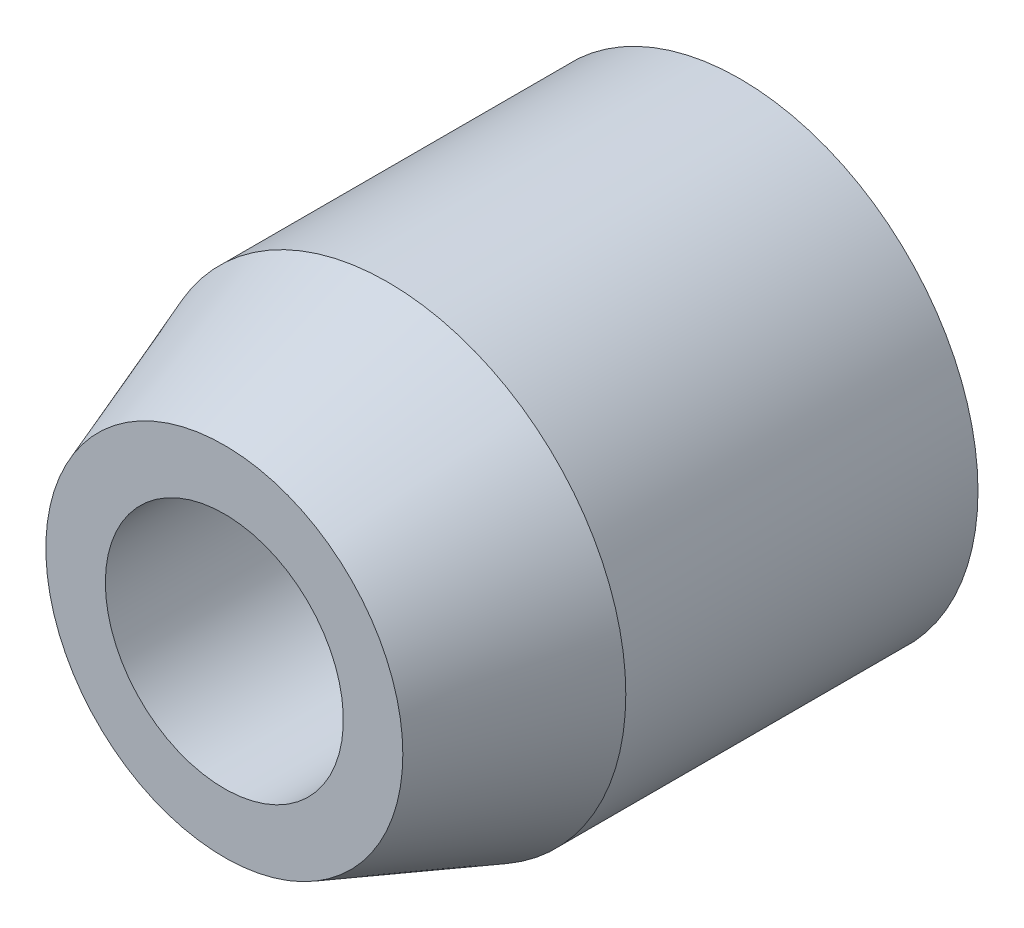
ISO-10303-21;
HEADER;
FILE_DESCRIPTION(('STEP AP214'),'2;1');
FILE_NAME('part.step','',(''),(''),'','','');
FILE_SCHEMA(('AUTOMOTIVE_DESIGN { 1 0 10303 214 1 1 1 1 }'));
ENDSEC;
DATA;
#1=APPLICATION_CONTEXT('core data for automotive mechanical design processes');
#2=APPLICATION_PROTOCOL_DEFINITION('international standard','automotive_design',2000,#1);
#3=PRODUCT_CONTEXT('',#1,'mechanical');
#4=PRODUCT('Part','Part','',(#3));
#5=PRODUCT_RELATED_PRODUCT_CATEGORY('part','',(#4));
#6=PRODUCT_DEFINITION_FORMATION('','',#4);
#7=PRODUCT_DEFINITION_CONTEXT('part definition',#1,'design');
#8=PRODUCT_DEFINITION('design','',#6,#7);
#9=PRODUCT_DEFINITION_SHAPE('','',#8);
#10=(LENGTH_UNIT() NAMED_UNIT(*) SI_UNIT(.MILLI.,.METRE.));
#11=(NAMED_UNIT(*) PLANE_ANGLE_UNIT() SI_UNIT($,.RADIAN.));
#12=(NAMED_UNIT(*) SI_UNIT($,.STERADIAN.) SOLID_ANGLE_UNIT());
#13=UNCERTAINTY_MEASURE_WITH_UNIT(LENGTH_MEASURE(1.E-05),#10,'distance_accuracy_value','');
#14=(GEOMETRIC_REPRESENTATION_CONTEXT(3) GLOBAL_UNCERTAINTY_ASSIGNED_CONTEXT((#13)) GLOBAL_UNIT_ASSIGNED_CONTEXT((#10,
#11,#12)) REPRESENTATION_CONTEXT('',''));
#15=CARTESIAN_POINT('',(0.,0.,0.));
#16=DIRECTION('',(0.,0.,1.));
#17=DIRECTION('',(1.,0.,0.));
#18=AXIS2_PLACEMENT_3D('',#15,#16,#17);
#19=CARTESIAN_POINT('',(0.,0.,13.));
#20=DIRECTION('',(0.,0.,1.));
#21=DIRECTION('',(1.,0.,0.));
#22=AXIS2_PLACEMENT_3D('',#19,#20,#21);
#23=PLANE('',#22);
#24=CARTESIAN_POINT('',(0.,0.,13.));
#25=DIRECTION('',(0.,0.,1.));
#26=DIRECTION('',(1.,0.,0.));
#27=AXIS2_PLACEMENT_3D('',#24,#25,#26);
#28=CIRCLE('',#27,3.);
#29=CARTESIAN_POINT('',(-3.,0.,13.));
#30=VERTEX_POINT('',#29);
#31=EDGE_CURVE('E51',#30,#30,#28,.T.);
#32=ORIENTED_EDGE('',*,*,#31,.F.);
#33=EDGE_LOOP('',(#32));
#34=FACE_BOUND('',#33,.T.);
#35=CARTESIAN_POINT('',(0.,0.,13.));
#36=DIRECTION('',(0.,0.,1.));
#37=DIRECTION('',(1.,0.,0.));
#38=AXIS2_PLACEMENT_3D('',#35,#36,#37);
#39=CIRCLE('',#38,4.5);
#40=CARTESIAN_POINT('',(4.5,0.,13.));
#41=VERTEX_POINT('',#40);
#42=EDGE_CURVE('E62',#41,#41,#39,.T.);
#43=ORIENTED_EDGE('',*,*,#42,.T.);
#44=EDGE_LOOP('',(#43));
#45=FACE_BOUND('',#44,.T.);
#46=ADVANCED_FACE('F42',(#34,#45),#23,.T.);
#47=CARTESIAN_POINT('',(0.,0.,13.));
#48=DIRECTION('',(0.,0.,-1.));
#49=DIRECTION('',(-1.,0.,0.));
#50=AXIS2_PLACEMENT_3D('',#47,#48,#49);
#51=CYLINDRICAL_SURFACE('',#50,6.);
#52=CARTESIAN_POINT('',(0.,0.,0.));
#53=DIRECTION('',(0.,0.,1.));
#54=DIRECTION('',(1.,0.,0.));
#55=AXIS2_PLACEMENT_3D('',#52,#53,#54);
#56=CIRCLE('',#55,6.);
#57=CARTESIAN_POINT('',(-6.,0.,0.));
#58=VERTEX_POINT('',#57);
#59=EDGE_CURVE('E11',#58,#58,#56,.T.);
#60=CARTESIAN_POINT('',(0.,0.,8.87878387081808));
#61=DIRECTION('',(0.,0.,-1.));
#62=DIRECTION('',(-1.,0.,0.));
#63=AXIS2_PLACEMENT_3D('',#60,#61,#62);
#64=CIRCLE('',#63,6.);
#65=CARTESIAN_POINT('',(-6.,0.,8.87878387081808));
#66=VERTEX_POINT('',#65);
#67=EDGE_CURVE('E46',#66,#66,#64,.F.);
#68=CARTESIAN_POINT('',(-6.,0.,0.));
#69=CARTESIAN_POINT('',(-6.,0.,0.0924873319876884));
#70=CARTESIAN_POINT('',(-6.,0.,0.184974663975377));
#71=CARTESIAN_POINT('',(-6.,0.,0.369949327950754));
#72=CARTESIAN_POINT('',(-6.,0.,0.462436659938442));
#73=CARTESIAN_POINT('',(-6.,0.,0.647411323913819));
#74=CARTESIAN_POINT('',(-6.,0.,0.739898655901507));
#75=CARTESIAN_POINT('',(-6.,0.,0.924873319876884));
#76=CARTESIAN_POINT('',(-6.,0.,1.01736065186457));
#77=CARTESIAN_POINT('',(-6.,0.,1.20233531583995));
#78=CARTESIAN_POINT('',(-6.,0.,1.29482264782764));
#79=CARTESIAN_POINT('',(-6.,0.,1.47979731180301));
#80=CARTESIAN_POINT('',(-6.,0.,1.5722846437907));
#81=CARTESIAN_POINT('',(-6.,0.,1.75725930776608));
#82=CARTESIAN_POINT('',(-6.,0.,1.84974663975377));
#83=CARTESIAN_POINT('',(-6.,0.,2.03472130372914));
#84=CARTESIAN_POINT('',(-6.,0.,2.12720863571683));
#85=CARTESIAN_POINT('',(-6.,0.,2.31218329969221));
#86=CARTESIAN_POINT('',(-6.,0.,2.4046706316799));
#87=CARTESIAN_POINT('',(-6.,0.,2.58964529565527));
#88=CARTESIAN_POINT('',(-6.,0.,2.68213262764296));
#89=CARTESIAN_POINT('',(-6.,0.,2.86710729161834));
#90=CARTESIAN_POINT('',(-6.,0.,2.95959462360603));
#91=CARTESIAN_POINT('',(-6.,0.,3.1445692875814));
#92=CARTESIAN_POINT('',(-6.,0.,3.23705661956909));
#93=CARTESIAN_POINT('',(-6.,0.,3.42203128354447));
#94=CARTESIAN_POINT('',(-6.,0.,3.51451861553216));
#95=CARTESIAN_POINT('',(-6.,0.,3.69949327950753));
#96=CARTESIAN_POINT('',(-6.,0.,3.79198061149522));
#97=CARTESIAN_POINT('',(-6.,0.,3.9769552754706));
#98=CARTESIAN_POINT('',(-6.,0.,4.06944260745829));
#99=CARTESIAN_POINT('',(-6.,0.,4.25441727143366));
#100=CARTESIAN_POINT('',(-6.,0.,4.34690460342135));
#101=CARTESIAN_POINT('',(-6.,0.,4.53187926739673));
#102=CARTESIAN_POINT('',(-6.,0.,4.62436659938442));
#103=CARTESIAN_POINT('',(-6.,0.,4.80934126335979));
#104=CARTESIAN_POINT('',(-6.,0.,4.90182859534748));
#105=CARTESIAN_POINT('',(-6.,0.,5.08680325932286));
#106=CARTESIAN_POINT('',(-6.,0.,5.17929059131055));
#107=CARTESIAN_POINT('',(-6.,0.,5.36426525528592));
#108=CARTESIAN_POINT('',(-6.,0.,5.45675258727361));
#109=CARTESIAN_POINT('',(-6.,0.,5.64172725124899));
#110=CARTESIAN_POINT('',(-6.,0.,5.73421458323668));
#111=CARTESIAN_POINT('',(-6.,0.,5.91918924721205));
#112=CARTESIAN_POINT('',(-6.,0.,6.01167657919974));
#113=CARTESIAN_POINT('',(-6.,0.,6.19665124317512));
#114=CARTESIAN_POINT('',(-6.,0.,6.28913857516281));
#115=CARTESIAN_POINT('',(-6.,0.,6.47411323913818));
#116=CARTESIAN_POINT('',(-6.,0.,6.56660057112587));
#117=CARTESIAN_POINT('',(-6.,0.,6.75157523510125));
#118=CARTESIAN_POINT('',(-6.,0.,6.84406256708894));
#119=CARTESIAN_POINT('',(-6.,0.,7.02903723106431));
#120=CARTESIAN_POINT('',(-6.,0.,7.121524563052));
#121=CARTESIAN_POINT('',(-6.,0.,7.30649922702738));
#122=CARTESIAN_POINT('',(-6.,0.,7.39898655901507));
#123=CARTESIAN_POINT('',(-6.,0.,7.58396122299044));
#124=CARTESIAN_POINT('',(-6.,0.,7.67644855497813));
#125=CARTESIAN_POINT('',(-6.,0.,7.86142321895351));
#126=CARTESIAN_POINT('',(-6.,0.,7.9539105509412));
#127=CARTESIAN_POINT('',(-6.,0.,8.13888521491657));
#128=CARTESIAN_POINT('',(-6.,0.,8.23137254690426));
#129=CARTESIAN_POINT('',(-6.,0.,8.41634721087964));
#130=CARTESIAN_POINT('',(-6.,0.,8.50883454286733));
#131=CARTESIAN_POINT('',(-6.,0.,8.6938092068427));
#132=CARTESIAN_POINT('',(-6.,0.,8.78629653883039));
#133=CARTESIAN_POINT('',(-6.,0.,8.87878387081808));
#134=B_SPLINE_CURVE_WITH_KNOTS('',3,(#68,#69,#70,#71,#72,#73,#74,#75,#76,#77,#78,#79,#80,#81,
#82,#83,#84,#85,#86,#87,#88,#89,#90,#91,#92,#93,#94,#95,#96,#97,#98,#99,#100,#101,#102,#103,
#104,#105,#106,#107,#108,#109,#110,#111,#112,#113,#114,#115,#116,#117,#118,#119,#120,#121,#122,
#123,#124,#125,#126,#127,#128,#129,#130,#131,#132,#133),.UNSPECIFIED.,.F.,.F.,(4,2,2,2,2,2,2,2,
2,2,2,2,2,2,2,2,2,2,2,2,2,2,2,2,2,2,2,2,2,2,2,2,4),(0.,0.277461995963065,0.55492399192613,
0.832385987889195,1.10984798385226,1.38730997981533,1.66477197577839,1.94223397174145,
2.21969596770452,2.49715796366758,2.77461995963065,3.05208195559372,3.32954395155678,
3.60700594751985,3.88446794348291,4.16192993944597,4.43939193540904,4.7168539313721,
4.99431592733517,5.27177792329823,5.5492399192613,5.82670191522436,6.10416391118743,
6.38162590715049,6.65908790311356,6.93654989907662,7.21401189503969,7.49147389100275,
7.76893588696582,8.04639788292888,8.32385987889195,8.60132187485501,8.87878387081808),.UNSPECIFIED.);
#135=EDGE_CURVE('BSEAM44',#58,#66,#134,.T.);
#136=ORIENTED_EDGE('',*,*,#59,.T.);
#137=ORIENTED_EDGE('',*,*,#67,.F.);
#138=ORIENTED_EDGE('',*,*,#135,.T.);
#139=ORIENTED_EDGE('',*,*,#135,.F.);
#140=EDGE_LOOP('',(#136,#138,#137,#139));
#141=FACE_BOUND('',#140,.T.);
#142=ADVANCED_FACE('F44',(#141),#51,.T.);
#143=CARTESIAN_POINT('',(0.,0.,0.));
#144=DIRECTION('',(0.,0.,1.));
#145=DIRECTION('',(1.,0.,0.));
#146=AXIS2_PLACEMENT_3D('',#143,#144,#145);
#147=PLANE('',#146);
#148=ORIENTED_EDGE('',*,*,#59,.F.);
#149=EDGE_LOOP('',(#148));
#150=FACE_BOUND('',#149,.T.);
#151=CARTESIAN_POINT('',(0.,0.,0.));
#152=DIRECTION('',(0.,0.,1.));
#153=DIRECTION('',(1.,0.,0.));
#154=AXIS2_PLACEMENT_3D('',#151,#152,#153);
#155=CIRCLE('',#154,3.);
#156=CARTESIAN_POINT('',(-3.,0.,0.));
#157=VERTEX_POINT('',#156);
#158=EDGE_CURVE('E56',#157,#157,#155,.T.);
#159=ORIENTED_EDGE('',*,*,#158,.T.);
#160=EDGE_LOOP('',(#159));
#161=FACE_BOUND('',#160,.T.);
#162=ADVANCED_FACE('F74',(#150,#161),#147,.F.);
#163=CARTESIAN_POINT('',(0.,0.,13.));
#164=DIRECTION('',(0.,0.,-1.));
#165=DIRECTION('',(-1.,0.,0.));
#166=AXIS2_PLACEMENT_3D('',#163,#164,#165);
#167=CYLINDRICAL_SURFACE('',#166,3.);
#168=CARTESIAN_POINT('',(-3.,0.,13.));
#169=CARTESIAN_POINT('',(-3.,0.,12.8645833333333));
#170=CARTESIAN_POINT('',(-3.,0.,12.7291666666667));
#171=CARTESIAN_POINT('',(-3.,0.,12.4583333333333));
#172=CARTESIAN_POINT('',(-3.,0.,12.3229166666667));
#173=CARTESIAN_POINT('',(-3.,0.,12.0520833333333));
#174=CARTESIAN_POINT('',(-3.,0.,11.9166666666667));
#175=CARTESIAN_POINT('',(-3.,0.,11.6458333333333));
#176=CARTESIAN_POINT('',(-3.,0.,11.5104166666667));
#177=CARTESIAN_POINT('',(-3.,0.,11.2395833333333));
#178=CARTESIAN_POINT('',(-3.,0.,11.1041666666667));
#179=CARTESIAN_POINT('',(-3.,0.,10.8333333333333));
#180=CARTESIAN_POINT('',(-3.,0.,10.6979166666667));
#181=CARTESIAN_POINT('',(-3.,0.,10.4270833333333));
#182=CARTESIAN_POINT('',(-3.,0.,10.2916666666667));
#183=CARTESIAN_POINT('',(-3.,0.,10.0208333333333));
#184=CARTESIAN_POINT('',(-3.,0.,9.88541666666667));
#185=CARTESIAN_POINT('',(-3.,0.,9.61458333333333));
#186=CARTESIAN_POINT('',(-3.,0.,9.47916666666667));
#187=CARTESIAN_POINT('',(-3.,0.,9.20833333333333));
#188=CARTESIAN_POINT('',(-3.,0.,9.07291666666667));
#189=CARTESIAN_POINT('',(-3.,0.,8.80208333333333));
#190=CARTESIAN_POINT('',(-3.,0.,8.66666666666667));
#191=CARTESIAN_POINT('',(-3.,0.,8.39583333333333));
#192=CARTESIAN_POINT('',(-3.,0.,8.26041666666667));
#193=CARTESIAN_POINT('',(-3.,0.,7.98958333333333));
#194=CARTESIAN_POINT('',(-3.,0.,7.85416666666667));
#195=CARTESIAN_POINT('',(-3.,0.,7.58333333333333));
#196=CARTESIAN_POINT('',(-3.,0.,7.44791666666667));
#197=CARTESIAN_POINT('',(-3.,0.,7.17708333333333));
#198=CARTESIAN_POINT('',(-3.,0.,7.04166666666667));
#199=CARTESIAN_POINT('',(-3.,0.,6.77083333333333));
#200=CARTESIAN_POINT('',(-3.,0.,6.63541666666667));
#201=CARTESIAN_POINT('',(-3.,0.,6.36458333333333));
#202=CARTESIAN_POINT('',(-3.,0.,6.22916666666667));
#203=CARTESIAN_POINT('',(-3.,0.,5.95833333333333));
#204=CARTESIAN_POINT('',(-3.,0.,5.82291666666667));
#205=CARTESIAN_POINT('',(-3.,0.,5.55208333333333));
#206=CARTESIAN_POINT('',(-3.,0.,5.41666666666667));
#207=CARTESIAN_POINT('',(-3.,0.,5.14583333333333));
#208=CARTESIAN_POINT('',(-3.,0.,5.01041666666667));
#209=CARTESIAN_POINT('',(-3.,0.,4.73958333333333));
#210=CARTESIAN_POINT('',(-3.,0.,4.60416666666667));
#211=CARTESIAN_POINT('',(-3.,0.,4.33333333333333));
#212=CARTESIAN_POINT('',(-3.,0.,4.19791666666667));
#213=CARTESIAN_POINT('',(-3.,0.,3.92708333333333));
#214=CARTESIAN_POINT('',(-3.,0.,3.79166666666667));
#215=CARTESIAN_POINT('',(-3.,0.,3.52083333333333));
#216=CARTESIAN_POINT('',(-3.,0.,3.38541666666667));
#217=CARTESIAN_POINT('',(-3.,0.,3.11458333333333));
#218=CARTESIAN_POINT('',(-3.,0.,2.97916666666667));
#219=CARTESIAN_POINT('',(-3.,0.,2.70833333333333));
#220=CARTESIAN_POINT('',(-3.,0.,2.57291666666667));
#221=CARTESIAN_POINT('',(-3.,0.,2.30208333333333));
#222=CARTESIAN_POINT('',(-3.,0.,2.16666666666667));
#223=CARTESIAN_POINT('',(-3.,0.,1.89583333333333));
#224=CARTESIAN_POINT('',(-3.,0.,1.76041666666667));
#225=CARTESIAN_POINT('',(-3.,0.,1.48958333333333));
#226=CARTESIAN_POINT('',(-3.,0.,1.35416666666667));
#227=CARTESIAN_POINT('',(-3.,0.,1.08333333333333));
#228=CARTESIAN_POINT('',(-3.,0.,0.947916666666667));
#229=CARTESIAN_POINT('',(-3.,0.,0.677083333333334));
#230=CARTESIAN_POINT('',(-3.,0.,0.541666666666667));
#231=CARTESIAN_POINT('',(-3.,0.,0.270833333333334));
#232=CARTESIAN_POINT('',(-3.,0.,0.135416666666667));
#233=CARTESIAN_POINT('',(-3.,0.,0.));
#234=B_SPLINE_CURVE_WITH_KNOTS('',3,(#168,#169,#170,#171,#172,#173,#174,#175,#176,#177,#178,
#179,#180,#181,#182,#183,#184,#185,#186,#187,#188,#189,#190,#191,#192,#193,#194,#195,#196,#197,
#198,#199,#200,#201,#202,#203,#204,#205,#206,#207,#208,#209,#210,#211,#212,#213,#214,#215,#216,
#217,#218,#219,#220,#221,#222,#223,#224,#225,#226,#227,#228,#229,#230,#231,#232,#233),
.UNSPECIFIED.,.F.,.F.,(4,2,2,2,2,2,2,2,2,2,2,2,2,2,2,2,2,2,2,2,2,2,2,2,2,2,2,2,2,2,2,2,4),(0.,
0.406249999999999,0.812499999999999,1.21875,1.625,2.03125,2.4375,2.84375,3.25,3.65625,4.0625,
4.46875,4.875,5.28125,5.6875,6.09375,6.5,6.90625,7.3125,7.71875,8.125,8.53125,8.9375,9.34375,
9.75,10.15625,10.5625,10.96875,11.375,11.78125,12.1875,12.59375,13.),.UNSPECIFIED.);
#235=EDGE_CURVE('BSEAM79',#30,#157,#234,.T.);
#236=ORIENTED_EDGE('',*,*,#31,.T.);
#237=ORIENTED_EDGE('',*,*,#158,.F.);
#238=ORIENTED_EDGE('',*,*,#235,.T.);
#239=ORIENTED_EDGE('',*,*,#235,.F.);
#240=EDGE_LOOP('',(#236,#238,#237,#239));
#241=FACE_BOUND('',#240,.T.);
#242=ADVANCED_FACE('F79',(#241),#167,.F.);
#243=CARTESIAN_POINT('',(0.,0.,13.));
#244=DIRECTION('',(0.,0.,-1.));
#245=DIRECTION('',(1.,0.,0.));
#246=AXIS2_PLACEMENT_3D('',#243,#244,#245);
#247=CONICAL_SURFACE('',#246,4.5,0.349065850398867);
#248=ORIENTED_EDGE('',*,*,#42,.F.);
#249=EDGE_LOOP('',(#248));
#250=FACE_BOUND('',#249,.T.);
#251=ORIENTED_EDGE('',*,*,#67,.T.);
#252=EDGE_LOOP('',(#251));
#253=FACE_BOUND('',#252,.T.);
#254=ADVANCED_FACE('F71',(#250,#253),#247,.T.);
#255=CLOSED_SHELL('',(#46,#142,#162,#242,#254));
#256=MANIFOLD_SOLID_BREP('B2',#255);
#257=ADVANCED_BREP_SHAPE_REPRESENTATION('',(#18,#256),#14);
#258=SHAPE_DEFINITION_REPRESENTATION(#9,#257);
ENDSEC;
END-ISO-10303-21;
